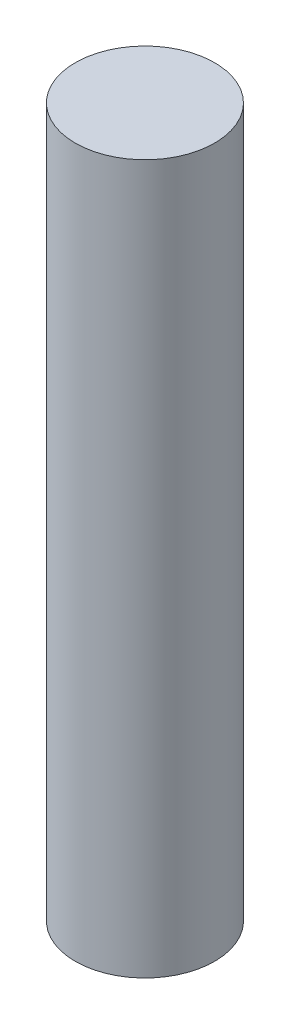
ISO-10303-21;
HEADER;
FILE_DESCRIPTION(('STEP AP214'),'2;1');
FILE_NAME('part.step','',(''),(''),'','','');
FILE_SCHEMA(('AUTOMOTIVE_DESIGN { 1 0 10303 214 1 1 1 1 }'));
ENDSEC;
DATA;
#1=APPLICATION_CONTEXT('core data for automotive mechanical design processes');
#2=APPLICATION_PROTOCOL_DEFINITION('international standard','automotive_design',2000,#1);
#3=PRODUCT_CONTEXT('',#1,'mechanical');
#4=PRODUCT('Part','Part','',(#3));
#5=PRODUCT_RELATED_PRODUCT_CATEGORY('part','',(#4));
#6=PRODUCT_DEFINITION_FORMATION('','',#4);
#7=PRODUCT_DEFINITION_CONTEXT('part definition',#1,'design');
#8=PRODUCT_DEFINITION('design','',#6,#7);
#9=PRODUCT_DEFINITION_SHAPE('','',#8);
#10=(LENGTH_UNIT() NAMED_UNIT(*) SI_UNIT(.MILLI.,.METRE.));
#11=(NAMED_UNIT(*) PLANE_ANGLE_UNIT() SI_UNIT($,.RADIAN.));
#12=(NAMED_UNIT(*) SI_UNIT($,.STERADIAN.) SOLID_ANGLE_UNIT());
#13=UNCERTAINTY_MEASURE_WITH_UNIT(LENGTH_MEASURE(1.E-05),#10,'distance_accuracy_value','');
#14=(GEOMETRIC_REPRESENTATION_CONTEXT(3) GLOBAL_UNCERTAINTY_ASSIGNED_CONTEXT((#13)) GLOBAL_UNIT_ASSIGNED_CONTEXT((#10,
#11,#12)) REPRESENTATION_CONTEXT('',''));
#15=CARTESIAN_POINT('',(0.,0.,0.));
#16=DIRECTION('',(0.,0.,1.));
#17=DIRECTION('',(1.,0.,0.));
#18=AXIS2_PLACEMENT_3D('',#15,#16,#17);
#19=CARTESIAN_POINT('',(0.,30.,0.));
#20=DIRECTION('',(0.,-1.,0.));
#21=DIRECTION('',(0.,0.,-1.));
#22=AXIS2_PLACEMENT_3D('',#19,#20,#21);
#23=CYLINDRICAL_SURFACE('',#22,2.95);
#24=CARTESIAN_POINT('',(0.,30.,0.));
#25=DIRECTION('',(0.,1.,0.));
#26=DIRECTION('',(0.,0.,1.));
#27=AXIS2_PLACEMENT_3D('',#24,#25,#26);
#28=CIRCLE('',#27,2.95);
#29=CARTESIAN_POINT('',(0.,30.,2.95));
#30=VERTEX_POINT('',#29);
#31=EDGE_CURVE('E10',#30,#30,#28,.T.);
#32=ORIENTED_EDGE('',*,*,#31,.F.);
#33=EDGE_LOOP('',(#32));
#34=FACE_BOUND('',#33,.T.);
#35=CARTESIAN_POINT('',(0.,0.,0.));
#36=DIRECTION('',(0.,1.,0.));
#37=DIRECTION('',(0.,0.,1.));
#38=AXIS2_PLACEMENT_3D('',#35,#36,#37);
#39=CIRCLE('',#38,2.95);
#40=CARTESIAN_POINT('',(0.,0.,2.95));
#41=VERTEX_POINT('',#40);
#42=EDGE_CURVE('E44',#41,#41,#39,.T.);
#43=ORIENTED_EDGE('',*,*,#42,.T.);
#44=EDGE_LOOP('',(#43));
#45=FACE_BOUND('',#44,.T.);
#46=ADVANCED_FACE('F41',(#34,#45),#23,.T.);
#47=CARTESIAN_POINT('',(0.,30.,0.));
#48=DIRECTION('',(0.,1.,0.));
#49=DIRECTION('',(0.,0.,1.));
#50=AXIS2_PLACEMENT_3D('',#47,#48,#49);
#51=PLANE('',#50);
#52=ORIENTED_EDGE('',*,*,#31,.T.);
#53=EDGE_LOOP('',(#52));
#54=FACE_BOUND('',#53,.T.);
#55=ADVANCED_FACE('F58',(#54),#51,.T.);
#56=CARTESIAN_POINT('',(0.,0.,0.));
#57=DIRECTION('',(0.,1.,0.));
#58=DIRECTION('',(0.,0.,1.));
#59=AXIS2_PLACEMENT_3D('',#56,#57,#58);
#60=PLANE('',#59);
#61=ORIENTED_EDGE('',*,*,#42,.F.);
#62=EDGE_LOOP('',(#61));
#63=FACE_BOUND('',#62,.T.);
#64=ADVANCED_FACE('F56',(#63),#60,.F.);
#65=CLOSED_SHELL('',(#46,#55,#64));
#66=MANIFOLD_SOLID_BREP('B2',#65);
#67=ADVANCED_BREP_SHAPE_REPRESENTATION('',(#18,#66),#14);
#68=SHAPE_DEFINITION_REPRESENTATION(#9,#67);
ENDSEC;
END-ISO-10303-21;
